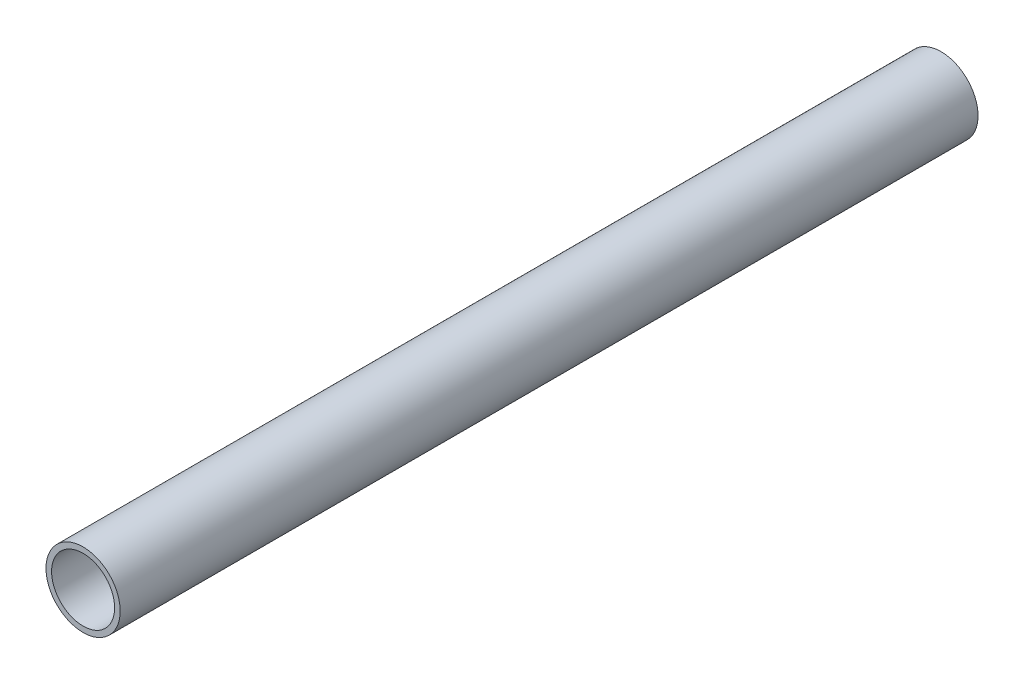
ISO-10303-21;
HEADER;
FILE_DESCRIPTION(('STEP AP214'),'2;1');
FILE_NAME('part.step','',(''),(''),'','','');
FILE_SCHEMA(('AUTOMOTIVE_DESIGN { 1 0 10303 214 1 1 1 1 }'));
ENDSEC;
DATA;
#1=APPLICATION_CONTEXT('core data for automotive mechanical design processes');
#2=APPLICATION_PROTOCOL_DEFINITION('international standard','automotive_design',2000,#1);
#3=PRODUCT_CONTEXT('',#1,'mechanical');
#4=PRODUCT('Part','Part','',(#3));
#5=PRODUCT_RELATED_PRODUCT_CATEGORY('part','',(#4));
#6=PRODUCT_DEFINITION_FORMATION('','',#4);
#7=PRODUCT_DEFINITION_CONTEXT('part definition',#1,'design');
#8=PRODUCT_DEFINITION('design','',#6,#7);
#9=PRODUCT_DEFINITION_SHAPE('','',#8);
#10=(LENGTH_UNIT() NAMED_UNIT(*) SI_UNIT(.MILLI.,.METRE.));
#11=(NAMED_UNIT(*) PLANE_ANGLE_UNIT() SI_UNIT($,.RADIAN.));
#12=(NAMED_UNIT(*) SI_UNIT($,.STERADIAN.) SOLID_ANGLE_UNIT());
#13=UNCERTAINTY_MEASURE_WITH_UNIT(LENGTH_MEASURE(1.E-05),#10,'distance_accuracy_value','');
#14=(GEOMETRIC_REPRESENTATION_CONTEXT(3) GLOBAL_UNCERTAINTY_ASSIGNED_CONTEXT((#13)) GLOBAL_UNIT_ASSIGNED_CONTEXT((#10,
#11,#12)) REPRESENTATION_CONTEXT('',''));
#15=CARTESIAN_POINT('',(0.,0.,0.));
#16=DIRECTION('',(0.,0.,1.));
#17=DIRECTION('',(1.,0.,0.));
#18=AXIS2_PLACEMENT_3D('',#15,#16,#17);
#19=CARTESIAN_POINT('',(0.,0.,0.));
#20=DIRECTION('',(0.,0.,1.));
#21=DIRECTION('',(1.,0.,0.));
#22=AXIS2_PLACEMENT_3D('',#19,#20,#21);
#23=PLANE('',#22);
#24=CARTESIAN_POINT('',(0.,0.,0.));
#25=DIRECTION('',(0.,0.,-1.));
#26=DIRECTION('',(1.,0.,0.));
#27=AXIS2_PLACEMENT_3D('',#24,#25,#26);
#28=CIRCLE('',#27,6.8);
#29=CARTESIAN_POINT('',(-6.8,0.,0.));
#30=VERTEX_POINT('',#29);
#31=EDGE_CURVE('E53',#30,#30,#28,.T.);
#32=ORIENTED_EDGE('',*,*,#31,.F.);
#33=EDGE_LOOP('',(#32));
#34=FACE_BOUND('',#33,.T.);
#35=CARTESIAN_POINT('',(0.,0.,0.));
#36=DIRECTION('',(0.,0.,1.));
#37=DIRECTION('',(1.,0.,0.));
#38=AXIS2_PLACEMENT_3D('',#35,#36,#37);
#39=CIRCLE('',#38,8.);
#40=CARTESIAN_POINT('',(-8.,0.,0.));
#41=VERTEX_POINT('',#40);
#42=EDGE_CURVE('E9',#41,#41,#39,.T.);
#43=ORIENTED_EDGE('',*,*,#42,.F.);
#44=EDGE_LOOP('',(#43));
#45=FACE_BOUND('',#44,.T.);
#46=ADVANCED_FACE('F14',(#34,#45),#23,.F.);
#47=CARTESIAN_POINT('',(0.,0.,185.));
#48=DIRECTION('',(0.,0.,1.));
#49=DIRECTION('',(1.,0.,0.));
#50=AXIS2_PLACEMENT_3D('',#47,#48,#49);
#51=PLANE('',#50);
#52=CARTESIAN_POINT('',(0.,0.,185.));
#53=DIRECTION('',(0.,0.,-1.));
#54=DIRECTION('',(1.,0.,0.));
#55=AXIS2_PLACEMENT_3D('',#52,#53,#54);
#56=CIRCLE('',#55,6.8);
#57=CARTESIAN_POINT('',(-6.8,0.,185.));
#58=VERTEX_POINT('',#57);
#59=EDGE_CURVE('E51',#58,#58,#56,.T.);
#60=ORIENTED_EDGE('',*,*,#59,.T.);
#61=EDGE_LOOP('',(#60));
#62=FACE_BOUND('',#61,.T.);
#63=CARTESIAN_POINT('',(0.,0.,185.));
#64=DIRECTION('',(0.,0.,1.));
#65=DIRECTION('',(1.,0.,0.));
#66=AXIS2_PLACEMENT_3D('',#63,#64,#65);
#67=CIRCLE('',#66,8.);
#68=CARTESIAN_POINT('',(-8.,0.,185.));
#69=VERTEX_POINT('',#68);
#70=EDGE_CURVE('E67',#69,#69,#67,.T.);
#71=ORIENTED_EDGE('',*,*,#70,.T.);
#72=EDGE_LOOP('',(#71));
#73=FACE_BOUND('',#72,.T.);
#74=ADVANCED_FACE('F57',(#62,#73),#51,.T.);
#75=CARTESIAN_POINT('',(0.,0.,0.));
#76=DIRECTION('',(0.,0.,1.));
#77=DIRECTION('',(1.,0.,0.));
#78=AXIS2_PLACEMENT_3D('',#75,#76,#77);
#79=CYLINDRICAL_SURFACE('',#78,8.);
#80=ORIENTED_EDGE('',*,*,#70,.F.);
#81=DIRECTION('',(0.,0.,-1.));
#82=VECTOR('',#81,1.);
#83=CARTESIAN_POINT('',(-8.,0.,0.));
#84=LINE('',#83,#82);
#85=EDGE_CURVE('E23',#69,#41,#84,.T.);
#86=ORIENTED_EDGE('',*,*,#85,.T.);
#87=ORIENTED_EDGE('',*,*,#42,.T.);
#88=ORIENTED_EDGE('',*,*,#85,.F.);
#89=EDGE_LOOP('',(#80,#86,#87,#88));
#90=FACE_BOUND('',#89,.T.);
#91=ADVANCED_FACE('F95',(#90),#79,.T.);
#92=CARTESIAN_POINT('',(0.,0.,0.));
#93=DIRECTION('',(0.,0.,1.));
#94=DIRECTION('',(1.,0.,0.));
#95=AXIS2_PLACEMENT_3D('',#92,#93,#94);
#96=CYLINDRICAL_SURFACE('',#95,6.8);
#97=ORIENTED_EDGE('',*,*,#59,.F.);
#98=DIRECTION('',(0.,0.,-1.));
#99=VECTOR('',#98,1.);
#100=CARTESIAN_POINT('',(-6.8,0.,0.));
#101=LINE('',#100,#99);
#102=EDGE_CURVE('E49',#58,#30,#101,.T.);
#103=ORIENTED_EDGE('',*,*,#102,.T.);
#104=ORIENTED_EDGE('',*,*,#31,.T.);
#105=ORIENTED_EDGE('',*,*,#102,.F.);
#106=EDGE_LOOP('',(#97,#103,#104,#105));
#107=FACE_BOUND('',#106,.T.);
#108=ADVANCED_FACE('F16',(#107),#96,.F.);
#109=CLOSED_SHELL('',(#46,#74,#91,#108));
#110=MANIFOLD_SOLID_BREP('B1',#109);
#111=ADVANCED_BREP_SHAPE_REPRESENTATION('',(#18,#110),#14);
#112=SHAPE_DEFINITION_REPRESENTATION(#9,#111);
ENDSEC;
END-ISO-10303-21;
